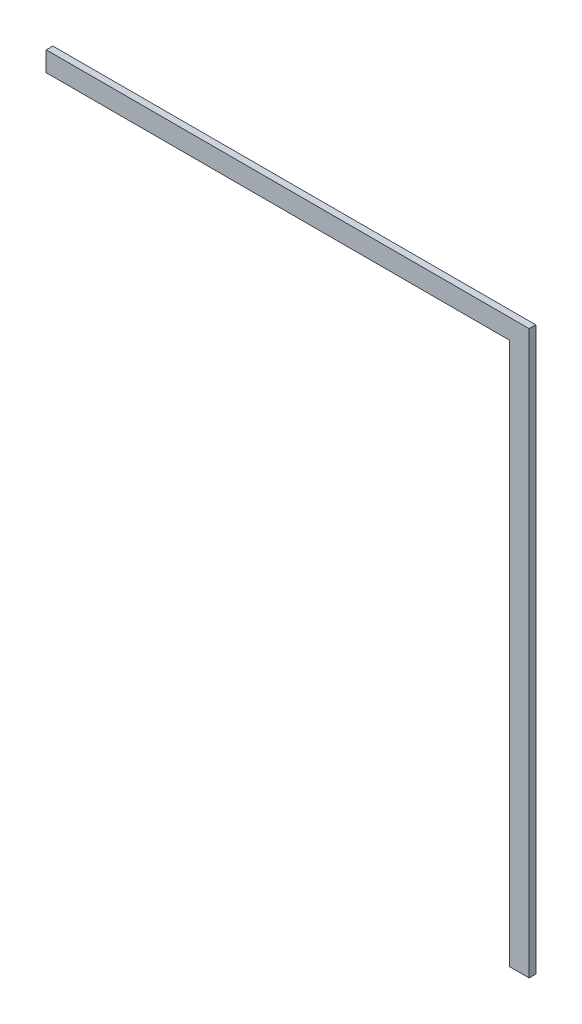
ISO-10303-21;
HEADER;
FILE_DESCRIPTION(('STEP AP214'),'2;1');
FILE_NAME('part.step','',(''),(''),'','','');
FILE_SCHEMA(('AUTOMOTIVE_DESIGN { 1 0 10303 214 1 1 1 1 }'));
ENDSEC;
DATA;
#1=APPLICATION_CONTEXT('core data for automotive mechanical design processes');
#2=APPLICATION_PROTOCOL_DEFINITION('international standard','automotive_design',2000,#1);
#3=PRODUCT_CONTEXT('',#1,'mechanical');
#4=PRODUCT('Part','Part','',(#3));
#5=PRODUCT_RELATED_PRODUCT_CATEGORY('part','',(#4));
#6=PRODUCT_DEFINITION_FORMATION('','',#4);
#7=PRODUCT_DEFINITION_CONTEXT('part definition',#1,'design');
#8=PRODUCT_DEFINITION('design','',#6,#7);
#9=PRODUCT_DEFINITION_SHAPE('','',#8);
#10=(LENGTH_UNIT() NAMED_UNIT(*) SI_UNIT(.MILLI.,.METRE.));
#11=(NAMED_UNIT(*) PLANE_ANGLE_UNIT() SI_UNIT($,.RADIAN.));
#12=(NAMED_UNIT(*) SI_UNIT($,.STERADIAN.) SOLID_ANGLE_UNIT());
#13=UNCERTAINTY_MEASURE_WITH_UNIT(LENGTH_MEASURE(1.E-05),#10,'distance_accuracy_value','');
#14=(GEOMETRIC_REPRESENTATION_CONTEXT(3) GLOBAL_UNCERTAINTY_ASSIGNED_CONTEXT((#13)) GLOBAL_UNIT_ASSIGNED_CONTEXT((#10,
#11,#12)) REPRESENTATION_CONTEXT('',''));
#15=CARTESIAN_POINT('',(0.,0.,0.));
#16=DIRECTION('',(0.,0.,1.));
#17=DIRECTION('',(1.,0.,0.));
#18=AXIS2_PLACEMENT_3D('',#15,#16,#17);
#19=CARTESIAN_POINT('',(352.,0.,2.));
#20=DIRECTION('',(0.,0.,1.));
#21=DIRECTION('',(1.,0.,0.));
#22=AXIS2_PLACEMENT_3D('',#19,#20,#21);
#23=PLANE('',#22);
#24=DIRECTION('',(0.,1.,0.));
#25=VECTOR('',#24,1.);
#26=CARTESIAN_POINT('',(352.,0.,2.));
#27=LINE('',#26,#25);
#28=CARTESIAN_POINT('',(352.,0.,2.));
#29=VERTEX_POINT('',#28);
#30=CARTESIAN_POINT('',(352.,164.,2.));
#31=VERTEX_POINT('',#30);
#32=EDGE_CURVE('E99',#29,#31,#27,.T.);
#33=ORIENTED_EDGE('',*,*,#32,.F.);
#34=DIRECTION('',(1.,0.,0.));
#35=VECTOR('',#34,1.);
#36=CARTESIAN_POINT('',(352.,0.,2.));
#37=LINE('',#36,#35);
#38=CARTESIAN_POINT('',(358.,0.,2.));
#39=VERTEX_POINT('',#38);
#40=EDGE_CURVE('E111',#29,#39,#37,.T.);
#41=ORIENTED_EDGE('',*,*,#40,.T.);
#42=DIRECTION('',(0.,1.,0.));
#43=VECTOR('',#42,1.);
#44=CARTESIAN_POINT('',(358.,0.,2.));
#45=LINE('',#44,#43);
#46=CARTESIAN_POINT('',(358.,170.,2.));
#47=VERTEX_POINT('',#46);
#48=EDGE_CURVE('E118',#39,#47,#45,.T.);
#49=ORIENTED_EDGE('',*,*,#48,.T.);
#50=DIRECTION('',(-1.,0.,0.));
#51=VECTOR('',#50,1.);
#52=CARTESIAN_POINT('',(358.,170.,2.));
#53=LINE('',#52,#51);
#54=CARTESIAN_POINT('',(212.,170.,2.));
#55=VERTEX_POINT('',#54);
#56=EDGE_CURVE('E123',#47,#55,#53,.T.);
#57=ORIENTED_EDGE('',*,*,#56,.T.);
#58=DIRECTION('',(0.,1.,0.));
#59=VECTOR('',#58,1.);
#60=CARTESIAN_POINT('',(212.,164.,2.));
#61=LINE('',#60,#59);
#62=CARTESIAN_POINT('',(212.,164.,2.));
#63=VERTEX_POINT('',#62);
#64=EDGE_CURVE('E126',#63,#55,#61,.T.);
#65=ORIENTED_EDGE('',*,*,#64,.F.);
#66=DIRECTION('',(1.,0.,0.));
#67=VECTOR('',#66,1.);
#68=CARTESIAN_POINT('',(212.,164.,2.));
#69=LINE('',#68,#67);
#70=EDGE_CURVE('E9',#63,#31,#69,.T.);
#71=ORIENTED_EDGE('',*,*,#70,.T.);
#72=EDGE_LOOP('',(#33,#41,#49,#57,#65,#71));
#73=FACE_BOUND('',#72,.T.);
#74=ADVANCED_FACE('F15',(#73),#23,.T.);
#75=CARTESIAN_POINT('',(212.,164.,0.));
#76=DIRECTION('',(0.,1.,0.));
#77=DIRECTION('',(1.,0.,0.));
#78=AXIS2_PLACEMENT_3D('',#75,#76,#77);
#79=PLANE('',#78);
#80=DIRECTION('',(0.,0.,1.));
#81=VECTOR('',#80,1.);
#82=CARTESIAN_POINT('',(352.,164.,0.));
#83=LINE('',#82,#81);
#84=CARTESIAN_POINT('',(352.,164.,0.));
#85=VERTEX_POINT('',#84);
#86=EDGE_CURVE('E85',#85,#31,#83,.T.);
#87=ORIENTED_EDGE('',*,*,#86,.T.);
#88=ORIENTED_EDGE('',*,*,#70,.F.);
#89=DIRECTION('',(0.,0.,1.));
#90=VECTOR('',#89,1.);
#91=CARTESIAN_POINT('',(212.,164.,0.));
#92=LINE('',#91,#90);
#93=CARTESIAN_POINT('',(212.,164.,0.));
#94=VERTEX_POINT('',#93);
#95=EDGE_CURVE('E83',#94,#63,#92,.T.);
#96=ORIENTED_EDGE('',*,*,#95,.F.);
#97=DIRECTION('',(1.,0.,0.));
#98=VECTOR('',#97,1.);
#99=CARTESIAN_POINT('',(212.,164.,0.));
#100=LINE('',#99,#98);
#101=EDGE_CURVE('E23',#94,#85,#100,.T.);
#102=ORIENTED_EDGE('',*,*,#101,.T.);
#103=EDGE_LOOP('',(#87,#88,#96,#102));
#104=FACE_BOUND('',#103,.T.);
#105=ADVANCED_FACE('F79',(#104),#79,.F.);
#106=CARTESIAN_POINT('',(352.,0.,0.));
#107=DIRECTION('',(0.,0.,1.));
#108=DIRECTION('',(1.,0.,0.));
#109=AXIS2_PLACEMENT_3D('',#106,#107,#108);
#110=PLANE('',#109);
#111=ORIENTED_EDGE('',*,*,#101,.F.);
#112=DIRECTION('',(0.,1.,0.));
#113=VECTOR('',#112,1.);
#114=CARTESIAN_POINT('',(212.,164.,0.));
#115=LINE('',#114,#113);
#116=CARTESIAN_POINT('',(212.,170.,0.));
#117=VERTEX_POINT('',#116);
#118=EDGE_CURVE('E139',#94,#117,#115,.T.);
#119=ORIENTED_EDGE('',*,*,#118,.T.);
#120=DIRECTION('',(1.,0.,0.));
#121=VECTOR('',#120,1.);
#122=CARTESIAN_POINT('',(212.,170.,0.));
#123=LINE('',#122,#121);
#124=CARTESIAN_POINT('',(358.,170.,0.));
#125=VERTEX_POINT('',#124);
#126=EDGE_CURVE('E113',#117,#125,#123,.T.);
#127=ORIENTED_EDGE('',*,*,#126,.T.);
#128=DIRECTION('',(0.,1.,0.));
#129=VECTOR('',#128,1.);
#130=CARTESIAN_POINT('',(358.,0.,0.));
#131=LINE('',#130,#129);
#132=CARTESIAN_POINT('',(358.,0.,0.));
#133=VERTEX_POINT('',#132);
#134=EDGE_CURVE('E129',#133,#125,#131,.T.);
#135=ORIENTED_EDGE('',*,*,#134,.F.);
#136=DIRECTION('',(1.,0.,0.));
#137=VECTOR('',#136,1.);
#138=CARTESIAN_POINT('',(352.,0.,0.));
#139=LINE('',#138,#137);
#140=CARTESIAN_POINT('',(352.,0.,0.));
#141=VERTEX_POINT('',#140);
#142=EDGE_CURVE('E89',#141,#133,#139,.T.);
#143=ORIENTED_EDGE('',*,*,#142,.F.);
#144=DIRECTION('',(0.,1.,0.));
#145=VECTOR('',#144,1.);
#146=CARTESIAN_POINT('',(352.,0.,0.));
#147=LINE('',#146,#145);
#148=EDGE_CURVE('E87',#141,#85,#147,.T.);
#149=ORIENTED_EDGE('',*,*,#148,.T.);
#150=EDGE_LOOP('',(#111,#119,#127,#135,#143,#149));
#151=FACE_BOUND('',#150,.T.);
#152=ADVANCED_FACE('F86',(#151),#110,.F.);
#153=CARTESIAN_POINT('',(212.,164.,0.));
#154=DIRECTION('',(1.,0.,0.));
#155=DIRECTION('',(0.,1.,0.));
#156=AXIS2_PLACEMENT_3D('',#153,#154,#155);
#157=PLANE('',#156);
#158=ORIENTED_EDGE('',*,*,#64,.T.);
#159=DIRECTION('',(0.,0.,1.));
#160=VECTOR('',#159,1.);
#161=CARTESIAN_POINT('',(212.,170.,0.));
#162=LINE('',#161,#160);
#163=EDGE_CURVE('E119',#117,#55,#162,.T.);
#164=ORIENTED_EDGE('',*,*,#163,.F.);
#165=ORIENTED_EDGE('',*,*,#118,.F.);
#166=ORIENTED_EDGE('',*,*,#95,.T.);
#167=EDGE_LOOP('',(#158,#164,#165,#166));
#168=FACE_BOUND('',#167,.T.);
#169=ADVANCED_FACE('F152',(#168),#157,.F.);
#170=CARTESIAN_POINT('',(352.,170.,0.));
#171=DIRECTION('',(0.,1.,0.));
#172=DIRECTION('',(1.,0.,0.));
#173=AXIS2_PLACEMENT_3D('',#170,#171,#172);
#174=PLANE('',#173);
#175=ORIENTED_EDGE('',*,*,#126,.F.);
#176=ORIENTED_EDGE('',*,*,#163,.T.);
#177=ORIENTED_EDGE('',*,*,#56,.F.);
#178=DIRECTION('',(0.,0.,1.));
#179=VECTOR('',#178,1.);
#180=CARTESIAN_POINT('',(358.,170.,0.));
#181=LINE('',#180,#179);
#182=EDGE_CURVE('E133',#125,#47,#181,.T.);
#183=ORIENTED_EDGE('',*,*,#182,.F.);
#184=EDGE_LOOP('',(#175,#176,#177,#183));
#185=FACE_BOUND('',#184,.T.);
#186=ADVANCED_FACE('F157',(#185),#174,.T.);
#187=CARTESIAN_POINT('',(358.,0.,0.));
#188=DIRECTION('',(1.,0.,0.));
#189=DIRECTION('',(0.,1.,0.));
#190=AXIS2_PLACEMENT_3D('',#187,#188,#189);
#191=PLANE('',#190);
#192=DIRECTION('',(0.,0.,1.));
#193=VECTOR('',#192,1.);
#194=CARTESIAN_POINT('',(358.,0.,0.));
#195=LINE('',#194,#193);
#196=EDGE_CURVE('E109',#133,#39,#195,.T.);
#197=ORIENTED_EDGE('',*,*,#196,.F.);
#198=ORIENTED_EDGE('',*,*,#134,.T.);
#199=ORIENTED_EDGE('',*,*,#182,.T.);
#200=ORIENTED_EDGE('',*,*,#48,.F.);
#201=EDGE_LOOP('',(#197,#198,#199,#200));
#202=FACE_BOUND('',#201,.T.);
#203=ADVANCED_FACE('F163',(#202),#191,.T.);
#204=CARTESIAN_POINT('',(352.,0.,0.));
#205=DIRECTION('',(0.,1.,0.));
#206=DIRECTION('',(1.,0.,0.));
#207=AXIS2_PLACEMENT_3D('',#204,#205,#206);
#208=PLANE('',#207);
#209=ORIENTED_EDGE('',*,*,#196,.T.);
#210=ORIENTED_EDGE('',*,*,#40,.F.);
#211=DIRECTION('',(0.,0.,1.));
#212=VECTOR('',#211,1.);
#213=CARTESIAN_POINT('',(352.,0.,0.));
#214=LINE('',#213,#212);
#215=EDGE_CURVE('E92',#141,#29,#214,.T.);
#216=ORIENTED_EDGE('',*,*,#215,.F.);
#217=ORIENTED_EDGE('',*,*,#142,.T.);
#218=EDGE_LOOP('',(#209,#210,#216,#217));
#219=FACE_BOUND('',#218,.T.);
#220=ADVANCED_FACE('F162',(#219),#208,.F.);
#221=CARTESIAN_POINT('',(352.,0.,0.));
#222=DIRECTION('',(1.,0.,0.));
#223=DIRECTION('',(0.,1.,0.));
#224=AXIS2_PLACEMENT_3D('',#221,#222,#223);
#225=PLANE('',#224);
#226=ORIENTED_EDGE('',*,*,#86,.F.);
#227=ORIENTED_EDGE('',*,*,#148,.F.);
#228=ORIENTED_EDGE('',*,*,#215,.T.);
#229=ORIENTED_EDGE('',*,*,#32,.T.);
#230=EDGE_LOOP('',(#226,#227,#228,#229));
#231=FACE_BOUND('',#230,.T.);
#232=ADVANCED_FACE('F98',(#231),#225,.F.);
#233=CLOSED_SHELL('',(#74,#105,#152,#169,#186,#203,#220,#232));
#234=MANIFOLD_SOLID_BREP('B1',#233);
#235=ADVANCED_BREP_SHAPE_REPRESENTATION('',(#18,#234),#14);
#236=SHAPE_DEFINITION_REPRESENTATION(#9,#235);
ENDSEC;
END-ISO-10303-21;
